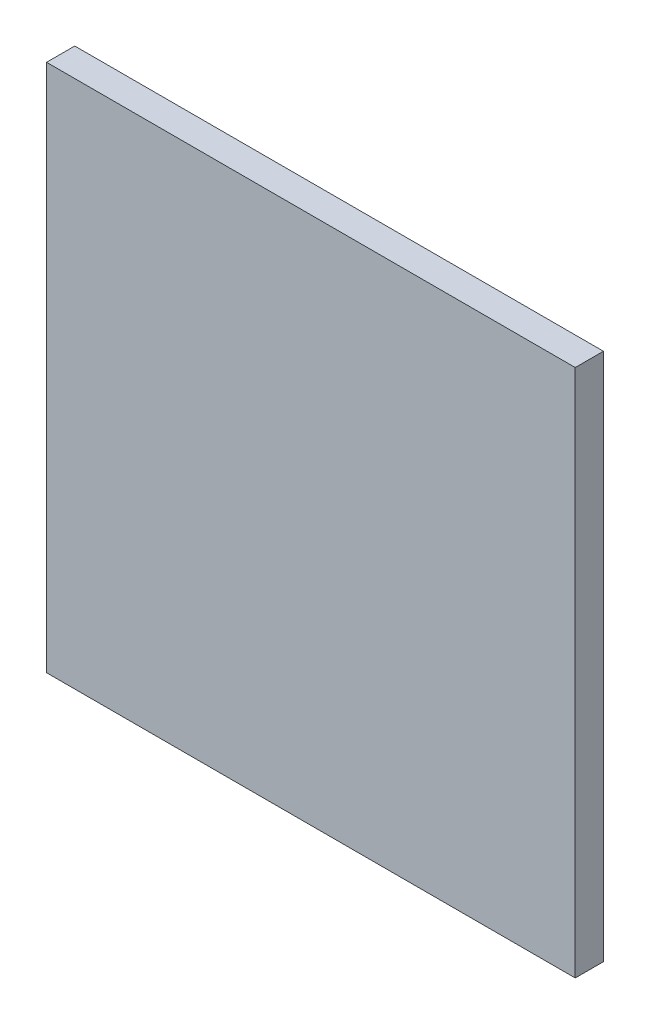
ISO-10303-21;
HEADER;
FILE_DESCRIPTION(('STEP AP214'),'2;1');
FILE_NAME('part.step','',(''),(''),'','','');
FILE_SCHEMA(('AUTOMOTIVE_DESIGN { 1 0 10303 214 1 1 1 1 }'));
ENDSEC;
DATA;
#1=APPLICATION_CONTEXT('core data for automotive mechanical design processes');
#2=APPLICATION_PROTOCOL_DEFINITION('international standard','automotive_design',2000,#1);
#3=PRODUCT_CONTEXT('',#1,'mechanical');
#4=PRODUCT('Part','Part','',(#3));
#5=PRODUCT_RELATED_PRODUCT_CATEGORY('part','',(#4));
#6=PRODUCT_DEFINITION_FORMATION('','',#4);
#7=PRODUCT_DEFINITION_CONTEXT('part definition',#1,'design');
#8=PRODUCT_DEFINITION('design','',#6,#7);
#9=PRODUCT_DEFINITION_SHAPE('','',#8);
#10=(LENGTH_UNIT() NAMED_UNIT(*) SI_UNIT(.MILLI.,.METRE.));
#11=(NAMED_UNIT(*) PLANE_ANGLE_UNIT() SI_UNIT($,.RADIAN.));
#12=(NAMED_UNIT(*) SI_UNIT($,.STERADIAN.) SOLID_ANGLE_UNIT());
#13=UNCERTAINTY_MEASURE_WITH_UNIT(LENGTH_MEASURE(1.E-05),#10,'distance_accuracy_value','');
#14=(GEOMETRIC_REPRESENTATION_CONTEXT(3) GLOBAL_UNCERTAINTY_ASSIGNED_CONTEXT((#13)) GLOBAL_UNIT_ASSIGNED_CONTEXT((#10,
#11,#12)) REPRESENTATION_CONTEXT('',''));
#15=CARTESIAN_POINT('',(0.,0.,0.));
#16=DIRECTION('',(0.,0.,1.));
#17=DIRECTION('',(1.,0.,0.));
#18=AXIS2_PLACEMENT_3D('',#15,#16,#17);
#19=CARTESIAN_POINT('',(0.,0.,-16.));
#20=DIRECTION('',(-1.00000000000001,0.,0.));
#21=DIRECTION('',(0.,-0.999999999999997,0.));
#22=AXIS2_PLACEMENT_3D('',#19,#20,#21);
#23=PLANE('',#22);
#24=DIRECTION('',(0.,-0.999999999999997,0.));
#25=VECTOR('',#24,1.);
#26=CARTESIAN_POINT('',(0.,0.,0.));
#27=LINE('',#26,#25);
#28=CARTESIAN_POINT('',(0.,0.,0.));
#29=VERTEX_POINT('',#28);
#30=CARTESIAN_POINT('',(0.,-300.,0.));
#31=VERTEX_POINT('',#30);
#32=EDGE_CURVE('E98',#29,#31,#27,.T.);
#33=ORIENTED_EDGE('',*,*,#32,.F.);
#34=DIRECTION('',(0.,0.,1.));
#35=VECTOR('',#34,1.);
#36=CARTESIAN_POINT('',(0.,0.,-16.));
#37=LINE('',#36,#35);
#38=CARTESIAN_POINT('',(0.,0.,-16.));
#39=VERTEX_POINT('',#38);
#40=EDGE_CURVE('E11',#39,#29,#37,.T.);
#41=ORIENTED_EDGE('',*,*,#40,.F.);
#42=DIRECTION('',(0.,-0.999999999999997,0.));
#43=VECTOR('',#42,1.);
#44=CARTESIAN_POINT('',(0.,0.,-16.));
#45=LINE('',#44,#43);
#46=CARTESIAN_POINT('',(0.,-300.,-16.));
#47=VERTEX_POINT('',#46);
#48=EDGE_CURVE('E92',#39,#47,#45,.T.);
#49=ORIENTED_EDGE('',*,*,#48,.T.);
#50=DIRECTION('',(0.,0.,1.));
#51=VECTOR('',#50,1.);
#52=CARTESIAN_POINT('',(0.,-300.,-16.));
#53=LINE('',#52,#51);
#54=EDGE_CURVE('E37',#47,#31,#53,.T.);
#55=ORIENTED_EDGE('',*,*,#54,.T.);
#56=EDGE_LOOP('',(#33,#41,#49,#55));
#57=FACE_BOUND('',#56,.T.);
#58=ADVANCED_FACE('F34',(#57),#23,.T.);
#59=CARTESIAN_POINT('',(0.,0.,-16.));
#60=DIRECTION('',(0.,0.999999999999997,0.));
#61=DIRECTION('',(0.,0.,1.));
#62=AXIS2_PLACEMENT_3D('',#59,#60,#61);
#63=PLANE('',#62);
#64=DIRECTION('',(-1.00000000000001,0.,0.));
#65=VECTOR('',#64,1.);
#66=CARTESIAN_POINT('',(0.,0.,0.));
#67=LINE('',#66,#65);
#68=CARTESIAN_POINT('',(300.000000000001,0.,-2.66453525910038E-12));
#69=VERTEX_POINT('',#68);
#70=EDGE_CURVE('E94',#69,#29,#67,.T.);
#71=ORIENTED_EDGE('',*,*,#70,.F.);
#72=DIRECTION('',(0.,0.,1.));
#73=VECTOR('',#72,1.);
#74=CARTESIAN_POINT('',(300.000000000001,0.,-16.0000000000027));
#75=LINE('',#74,#73);
#76=CARTESIAN_POINT('',(300.000000000001,0.,-16.0000000000027));
#77=VERTEX_POINT('',#76);
#78=EDGE_CURVE('E43',#77,#69,#75,.T.);
#79=ORIENTED_EDGE('',*,*,#78,.F.);
#80=DIRECTION('',(-1.00000000000001,0.,0.));
#81=VECTOR('',#80,1.);
#82=CARTESIAN_POINT('',(0.,0.,-16.));
#83=LINE('',#82,#81);
#84=EDGE_CURVE('E89',#77,#39,#83,.T.);
#85=ORIENTED_EDGE('',*,*,#84,.T.);
#86=ORIENTED_EDGE('',*,*,#40,.T.);
#87=EDGE_LOOP('',(#71,#79,#85,#86));
#88=FACE_BOUND('',#87,.T.);
#89=ADVANCED_FACE('F108',(#88),#63,.T.);
#90=CARTESIAN_POINT('',(300.000000000001,0.,-16.0000000000027));
#91=DIRECTION('',(1.00000000000001,0.,0.));
#92=DIRECTION('',(0.,0.999999999999997,0.));
#93=AXIS2_PLACEMENT_3D('',#90,#91,#92);
#94=PLANE('',#93);
#95=DIRECTION('',(0.,0.999999999999997,0.));
#96=VECTOR('',#95,1.);
#97=CARTESIAN_POINT('',(300.000000000001,0.,-2.66453525910038E-12));
#98=LINE('',#97,#96);
#99=CARTESIAN_POINT('',(300.000000000001,-300.,0.));
#100=VERTEX_POINT('',#99);
#101=EDGE_CURVE('E84',#100,#69,#98,.T.);
#102=ORIENTED_EDGE('',*,*,#101,.F.);
#103=DIRECTION('',(0.,0.,1.));
#104=VECTOR('',#103,1.);
#105=CARTESIAN_POINT('',(300.000000000001,-300.,-16.));
#106=LINE('',#105,#104);
#107=CARTESIAN_POINT('',(300.000000000001,-300.,-16.));
#108=VERTEX_POINT('',#107);
#109=EDGE_CURVE('E79',#108,#100,#106,.T.);
#110=ORIENTED_EDGE('',*,*,#109,.F.);
#111=DIRECTION('',(0.,0.999999999999997,0.));
#112=VECTOR('',#111,1.);
#113=CARTESIAN_POINT('',(300.000000000001,0.,-16.0000000000027));
#114=LINE('',#113,#112);
#115=EDGE_CURVE('E82',#108,#77,#114,.T.);
#116=ORIENTED_EDGE('',*,*,#115,.T.);
#117=ORIENTED_EDGE('',*,*,#78,.T.);
#118=EDGE_LOOP('',(#102,#110,#116,#117));
#119=FACE_BOUND('',#118,.T.);
#120=ADVANCED_FACE('F81',(#119),#94,.T.);
#121=CARTESIAN_POINT('',(0.,-300.,-16.));
#122=DIRECTION('',(0.,-0.999999999999997,0.));
#123=DIRECTION('',(0.,0.,-1.));
#124=AXIS2_PLACEMENT_3D('',#121,#122,#123);
#125=PLANE('',#124);
#126=DIRECTION('',(1.00000000000001,0.,0.));
#127=VECTOR('',#126,1.);
#128=CARTESIAN_POINT('',(0.,-300.,0.));
#129=LINE('',#128,#127);
#130=EDGE_CURVE('E101',#31,#100,#129,.T.);
#131=ORIENTED_EDGE('',*,*,#130,.F.);
#132=ORIENTED_EDGE('',*,*,#54,.F.);
#133=DIRECTION('',(1.00000000000001,0.,0.));
#134=VECTOR('',#133,1.);
#135=CARTESIAN_POINT('',(0.,-300.,-16.));
#136=LINE('',#135,#134);
#137=EDGE_CURVE('E88',#47,#108,#136,.T.);
#138=ORIENTED_EDGE('',*,*,#137,.T.);
#139=ORIENTED_EDGE('',*,*,#109,.T.);
#140=EDGE_LOOP('',(#131,#132,#138,#139));
#141=FACE_BOUND('',#140,.T.);
#142=ADVANCED_FACE('F91',(#141),#125,.T.);
#143=CARTESIAN_POINT('',(0.,0.,-16.));
#144=DIRECTION('',(0.,0.,1.));
#145=DIRECTION('',(1.00000000000001,0.,0.));
#146=AXIS2_PLACEMENT_3D('',#143,#144,#145);
#147=PLANE('',#146);
#148=ORIENTED_EDGE('',*,*,#48,.F.);
#149=ORIENTED_EDGE('',*,*,#84,.F.);
#150=ORIENTED_EDGE('',*,*,#115,.F.);
#151=ORIENTED_EDGE('',*,*,#137,.F.);
#152=EDGE_LOOP('',(#148,#149,#150,#151));
#153=FACE_BOUND('',#152,.T.);
#154=ADVANCED_FACE('F87',(#153),#147,.F.);
#155=CARTESIAN_POINT('',(0.,0.,0.));
#156=DIRECTION('',(0.,0.,1.));
#157=DIRECTION('',(1.00000000000001,0.,0.));
#158=AXIS2_PLACEMENT_3D('',#155,#156,#157);
#159=PLANE('',#158);
#160=ORIENTED_EDGE('',*,*,#32,.T.);
#161=ORIENTED_EDGE('',*,*,#130,.T.);
#162=ORIENTED_EDGE('',*,*,#101,.T.);
#163=ORIENTED_EDGE('',*,*,#70,.T.);
#164=EDGE_LOOP('',(#160,#161,#162,#163));
#165=FACE_BOUND('',#164,.T.);
#166=ADVANCED_FACE('F107',(#165),#159,.T.);
#167=CLOSED_SHELL('',(#58,#89,#120,#142,#154,#166));
#168=MANIFOLD_SOLID_BREP('B2',#167);
#169=ADVANCED_BREP_SHAPE_REPRESENTATION('',(#18,#168),#14);
#170=SHAPE_DEFINITION_REPRESENTATION(#9,#169);
ENDSEC;
END-ISO-10303-21;
